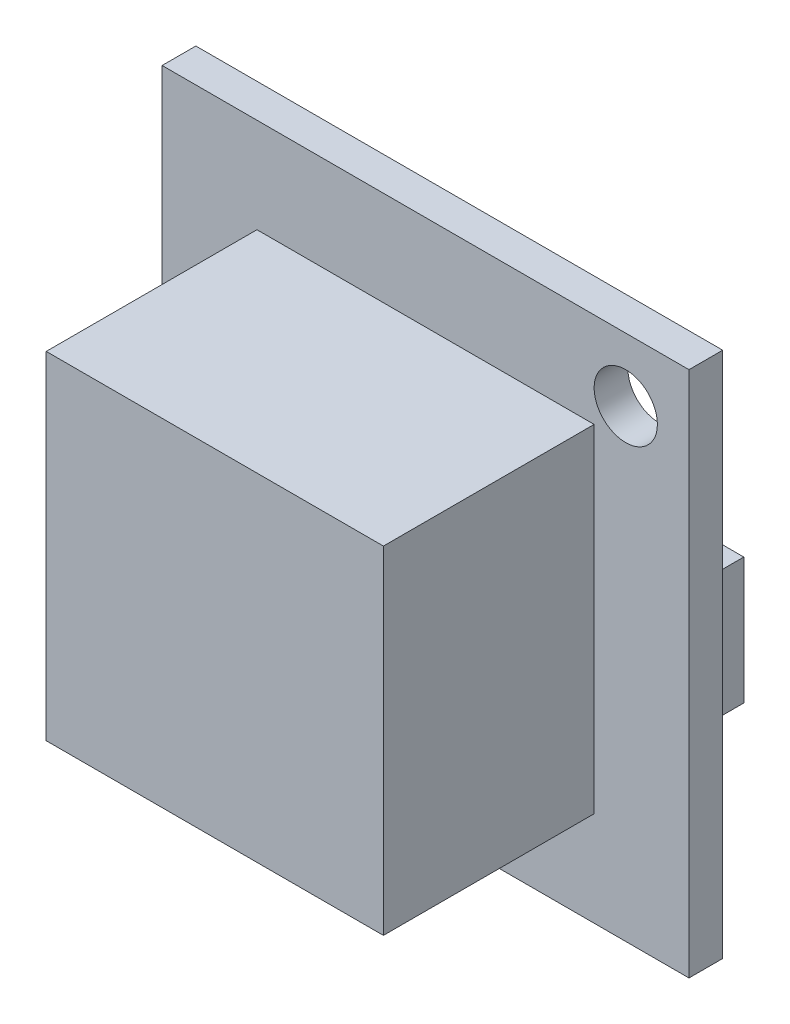
ISO-10303-21;
HEADER;
FILE_DESCRIPTION(('STEP AP214'),'2;1');
FILE_NAME('part.step','',(''),(''),'','','');
FILE_SCHEMA(('AUTOMOTIVE_DESIGN { 1 0 10303 214 1 1 1 1 }'));
ENDSEC;
DATA;
#1=APPLICATION_CONTEXT('core data for automotive mechanical design processes');
#2=APPLICATION_PROTOCOL_DEFINITION('international standard','automotive_design',2000,#1);
#3=PRODUCT_CONTEXT('',#1,'mechanical');
#4=PRODUCT('Part','Part','',(#3));
#5=PRODUCT_RELATED_PRODUCT_CATEGORY('part','',(#4));
#6=PRODUCT_DEFINITION_FORMATION('','',#4);
#7=PRODUCT_DEFINITION_CONTEXT('part definition',#1,'design');
#8=PRODUCT_DEFINITION('design','',#6,#7);
#9=PRODUCT_DEFINITION_SHAPE('','',#8);
#10=(LENGTH_UNIT() NAMED_UNIT(*) SI_UNIT(.MILLI.,.METRE.));
#11=(NAMED_UNIT(*) PLANE_ANGLE_UNIT() SI_UNIT($,.RADIAN.));
#12=(NAMED_UNIT(*) SI_UNIT($,.STERADIAN.) SOLID_ANGLE_UNIT());
#13=UNCERTAINTY_MEASURE_WITH_UNIT(LENGTH_MEASURE(1.E-05),#10,'distance_accuracy_value','');
#14=(GEOMETRIC_REPRESENTATION_CONTEXT(3) GLOBAL_UNCERTAINTY_ASSIGNED_CONTEXT((#13)) GLOBAL_UNIT_ASSIGNED_CONTEXT((#10,
#11,#12)) REPRESENTATION_CONTEXT('',''));
#15=CARTESIAN_POINT('',(0.,0.,0.));
#16=DIRECTION('',(0.,0.,1.));
#17=DIRECTION('',(1.,0.,0.));
#18=AXIS2_PLACEMENT_3D('',#15,#16,#17);
#19=CARTESIAN_POINT('',(3.5,-12.5,-8.));
#20=DIRECTION('',(-1.,0.,0.));
#21=DIRECTION('',(0.,0.,1.));
#22=AXIS2_PLACEMENT_3D('',#19,#20,#21);
#23=PLANE('',#22);
#24=DIRECTION('',(0.,-1.,0.));
#25=VECTOR('',#24,1.);
#26=CARTESIAN_POINT('',(3.5,-12.5,0.));
#27=LINE('',#26,#25);
#28=CARTESIAN_POINT('',(3.5,-7.5,0.));
#29=VERTEX_POINT('',#28);
#30=CARTESIAN_POINT('',(3.5,-12.5,0.));
#31=VERTEX_POINT('',#30);
#32=EDGE_CURVE('E108',#29,#31,#27,.T.);
#33=ORIENTED_EDGE('',*,*,#32,.T.);
#34=DIRECTION('',(0.,0.,1.));
#35=VECTOR('',#34,1.);
#36=CARTESIAN_POINT('',(3.5,-12.5,-8.));
#37=LINE('',#36,#35);
#38=CARTESIAN_POINT('',(3.5,-12.5,-8.));
#39=VERTEX_POINT('',#38);
#40=EDGE_CURVE('E12',#39,#31,#37,.T.);
#41=ORIENTED_EDGE('',*,*,#40,.F.);
#42=DIRECTION('',(0.,-1.,0.));
#43=VECTOR('',#42,1.);
#44=CARTESIAN_POINT('',(3.5,-12.5,-8.));
#45=LINE('',#44,#43);
#46=CARTESIAN_POINT('',(3.5,-7.5,-8.));
#47=VERTEX_POINT('',#46);
#48=EDGE_CURVE('E96',#47,#39,#45,.T.);
#49=ORIENTED_EDGE('',*,*,#48,.F.);
#50=DIRECTION('',(0.,0.,1.));
#51=VECTOR('',#50,1.);
#52=CARTESIAN_POINT('',(3.5,-7.5,-8.));
#53=LINE('',#52,#51);
#54=EDGE_CURVE('E104',#47,#29,#53,.T.);
#55=ORIENTED_EDGE('',*,*,#54,.T.);
#56=EDGE_LOOP('',(#33,#41,#49,#55));
#57=FACE_BOUND('',#56,.T.);
#58=ADVANCED_FACE('F45',(#57),#23,.F.);
#59=CARTESIAN_POINT('',(3.5,-12.5,-8.));
#60=DIRECTION('',(0.,1.,0.));
#61=DIRECTION('',(0.,0.,1.));
#62=AXIS2_PLACEMENT_3D('',#59,#60,#61);
#63=PLANE('',#62);
#64=DIRECTION('',(-1.,0.,0.));
#65=VECTOR('',#64,1.);
#66=CARTESIAN_POINT('',(3.5,-12.5,0.));
#67=LINE('',#66,#65);
#68=CARTESIAN_POINT('',(-3.5,-12.5,0.));
#69=VERTEX_POINT('',#68);
#70=EDGE_CURVE('E100',#31,#69,#67,.T.);
#71=ORIENTED_EDGE('',*,*,#70,.T.);
#72=DIRECTION('',(0.,0.,1.));
#73=VECTOR('',#72,1.);
#74=CARTESIAN_POINT('',(-3.5,-12.5,-8.));
#75=LINE('',#74,#73);
#76=CARTESIAN_POINT('',(-3.5,-12.5,-8.));
#77=VERTEX_POINT('',#76);
#78=EDGE_CURVE('E53',#77,#69,#75,.T.);
#79=ORIENTED_EDGE('',*,*,#78,.F.);
#80=DIRECTION('',(-1.,0.,0.));
#81=VECTOR('',#80,1.);
#82=CARTESIAN_POINT('',(3.5,-12.5,-8.));
#83=LINE('',#82,#81);
#84=EDGE_CURVE('E91',#39,#77,#83,.T.);
#85=ORIENTED_EDGE('',*,*,#84,.F.);
#86=ORIENTED_EDGE('',*,*,#40,.T.);
#87=EDGE_LOOP('',(#71,#79,#85,#86));
#88=FACE_BOUND('',#87,.T.);
#89=ADVANCED_FACE('F99',(#88),#63,.F.);
#90=CARTESIAN_POINT('',(-3.5,-12.5,-8.));
#91=DIRECTION('',(1.,0.,0.));
#92=DIRECTION('',(0.,1.,0.));
#93=AXIS2_PLACEMENT_3D('',#90,#91,#92);
#94=PLANE('',#93);
#95=DIRECTION('',(0.,1.,0.));
#96=VECTOR('',#95,1.);
#97=CARTESIAN_POINT('',(-3.5,-12.5,0.));
#98=LINE('',#97,#96);
#99=CARTESIAN_POINT('',(-3.5,-7.5,0.));
#100=VERTEX_POINT('',#99);
#101=EDGE_CURVE('E78',#69,#100,#98,.T.);
#102=ORIENTED_EDGE('',*,*,#101,.T.);
#103=DIRECTION('',(0.,0.,1.));
#104=VECTOR('',#103,1.);
#105=CARTESIAN_POINT('',(-3.5,-7.5,-8.));
#106=LINE('',#105,#104);
#107=CARTESIAN_POINT('',(-3.5,-7.5,-8.));
#108=VERTEX_POINT('',#107);
#109=EDGE_CURVE('E101',#108,#100,#106,.T.);
#110=ORIENTED_EDGE('',*,*,#109,.F.);
#111=DIRECTION('',(0.,1.,0.));
#112=VECTOR('',#111,1.);
#113=CARTESIAN_POINT('',(-3.5,-12.5,-8.));
#114=LINE('',#113,#112);
#115=EDGE_CURVE('E94',#77,#108,#114,.T.);
#116=ORIENTED_EDGE('',*,*,#115,.F.);
#117=ORIENTED_EDGE('',*,*,#78,.T.);
#118=EDGE_LOOP('',(#102,#110,#116,#117));
#119=FACE_BOUND('',#118,.T.);
#120=ADVANCED_FACE('F102',(#119),#94,.F.);
#121=CARTESIAN_POINT('',(3.5,-7.5,-8.));
#122=DIRECTION('',(0.,-1.,0.));
#123=DIRECTION('',(1.,0.,0.));
#124=AXIS2_PLACEMENT_3D('',#121,#122,#123);
#125=PLANE('',#124);
#126=DIRECTION('',(1.,0.,0.));
#127=VECTOR('',#126,1.);
#128=CARTESIAN_POINT('',(3.5,-7.5,0.));
#129=LINE('',#128,#127);
#130=EDGE_CURVE('E84',#100,#29,#129,.T.);
#131=ORIENTED_EDGE('',*,*,#130,.T.);
#132=ORIENTED_EDGE('',*,*,#54,.F.);
#133=DIRECTION('',(1.,0.,0.));
#134=VECTOR('',#133,1.);
#135=CARTESIAN_POINT('',(3.5,-7.5,-8.));
#136=LINE('',#135,#134);
#137=EDGE_CURVE('E61',#108,#47,#136,.T.);
#138=ORIENTED_EDGE('',*,*,#137,.F.);
#139=ORIENTED_EDGE('',*,*,#109,.T.);
#140=EDGE_LOOP('',(#131,#132,#138,#139));
#141=FACE_BOUND('',#140,.T.);
#142=ADVANCED_FACE('F115',(#141),#125,.F.);
#143=CARTESIAN_POINT('',(0.,0.,-8.));
#144=DIRECTION('',(0.,0.,1.));
#145=DIRECTION('',(1.,0.,0.));
#146=AXIS2_PLACEMENT_3D('',#143,#144,#145);
#147=PLANE('',#146);
#148=ORIENTED_EDGE('',*,*,#48,.T.);
#149=ORIENTED_EDGE('',*,*,#84,.T.);
#150=ORIENTED_EDGE('',*,*,#115,.T.);
#151=ORIENTED_EDGE('',*,*,#137,.T.);
#152=EDGE_LOOP('',(#148,#149,#150,#151));
#153=FACE_BOUND('',#152,.T.);
#154=ADVANCED_FACE('F92',(#153),#147,.F.);
#155=CARTESIAN_POINT('',(0.,0.,0.));
#156=DIRECTION('',(0.,0.,1.));
#157=DIRECTION('',(1.,0.,0.));
#158=AXIS2_PLACEMENT_3D('',#155,#156,#157);
#159=PLANE('',#158);
#160=ORIENTED_EDGE('',*,*,#32,.F.);
#161=ORIENTED_EDGE('',*,*,#130,.F.);
#162=ORIENTED_EDGE('',*,*,#101,.F.);
#163=ORIENTED_EDGE('',*,*,#70,.F.);
#164=EDGE_LOOP('',(#160,#161,#162,#163));
#165=FACE_BOUND('',#164,.T.);
#166=ADVANCED_FACE('F118',(#165),#159,.T.);
#167=CLOSED_SHELL('',(#58,#89,#120,#142,#154,#166));
#168=MANIFOLD_SOLID_BREP('B2',#167);
#169=CARTESIAN_POINT('',(0.,0.,0.));
#170=DIRECTION('',(0.,0.,-1.));
#171=DIRECTION('',(-1.,0.,0.));
#172=AXIS2_PLACEMENT_3D('',#169,#170,#171);
#173=PLANE('',#172);
#174=DIRECTION('',(0.,-1.,0.));
#175=VECTOR('',#174,1.);
#176=CARTESIAN_POINT('',(-12.5,12.5,0.));
#177=LINE('',#176,#175);
#178=CARTESIAN_POINT('',(-12.5,12.5,0.));
#179=VERTEX_POINT('',#178);
#180=CARTESIAN_POINT('',(-12.5,-12.5,0.));
#181=VERTEX_POINT('',#180);
#182=EDGE_CURVE('E337',#179,#181,#177,.T.);
#183=ORIENTED_EDGE('',*,*,#182,.F.);
#184=DIRECTION('',(-1.,0.,0.));
#185=VECTOR('',#184,1.);
#186=CARTESIAN_POINT('',(12.5,12.5,0.));
#187=LINE('',#186,#185);
#188=CARTESIAN_POINT('',(12.5,12.5,0.));
#189=VERTEX_POINT('',#188);
#190=EDGE_CURVE('E344',#189,#179,#187,.T.);
#191=ORIENTED_EDGE('',*,*,#190,.F.);
#192=DIRECTION('',(0.,1.,0.));
#193=VECTOR('',#192,1.);
#194=CARTESIAN_POINT('',(12.5,12.5,0.));
#195=LINE('',#194,#193);
#196=CARTESIAN_POINT('',(12.5,-12.5,0.));
#197=VERTEX_POINT('',#196);
#198=EDGE_CURVE('E355',#197,#189,#195,.T.);
#199=ORIENTED_EDGE('',*,*,#198,.F.);
#200=DIRECTION('',(1.,0.,0.));
#201=VECTOR('',#200,1.);
#202=CARTESIAN_POINT('',(12.5,-12.5,0.));
#203=LINE('',#202,#201);
#204=EDGE_CURVE('E353',#181,#197,#203,.T.);
#205=ORIENTED_EDGE('',*,*,#204,.F.);
#206=EDGE_LOOP('',(#183,#191,#199,#205));
#207=FACE_BOUND('',#206,.T.);
#208=CARTESIAN_POINT('',(9.50000000000001,9.5,0.));
#209=DIRECTION('',(0.,0.,1.));
#210=DIRECTION('',(1.,0.,0.));
#211=AXIS2_PLACEMENT_3D('',#208,#209,#210);
#212=CIRCLE('',#211,1.5);
#213=CARTESIAN_POINT('',(11.,9.5,0.));
#214=VERTEX_POINT('',#213);
#215=EDGE_CURVE('E334',#214,#214,#212,.T.);
#216=ORIENTED_EDGE('',*,*,#215,.T.);
#217=EDGE_LOOP('',(#216));
#218=FACE_BOUND('',#217,.T.);
#219=CARTESIAN_POINT('',(-9.5,-9.5,0.));
#220=DIRECTION('',(0.,0.,1.));
#221=DIRECTION('',(1.,0.,0.));
#222=AXIS2_PLACEMENT_3D('',#219,#220,#221);
#223=CIRCLE('',#222,1.5);
#224=CARTESIAN_POINT('',(-8.,-9.5,0.));
#225=VERTEX_POINT('',#224);
#226=EDGE_CURVE('E328',#225,#225,#223,.T.);
#227=ORIENTED_EDGE('',*,*,#226,.T.);
#228=EDGE_LOOP('',(#227));
#229=FACE_BOUND('',#228,.T.);
#230=DIRECTION('',(-1.,0.,0.));
#231=VECTOR('',#230,1.);
#232=CARTESIAN_POINT('',(11.5,-3.5,0.));
#233=LINE('',#232,#231);
#234=CARTESIAN_POINT('',(11.5,-3.5,0.));
#235=VERTEX_POINT('',#234);
#236=CARTESIAN_POINT('',(5.5,-3.5,0.));
#237=VERTEX_POINT('',#236);
#238=EDGE_CURVE('E573',#235,#237,#233,.T.);
#239=ORIENTED_EDGE('',*,*,#238,.F.);
#240=DIRECTION('',(0.,-1.,0.));
#241=VECTOR('',#240,1.);
#242=CARTESIAN_POINT('',(11.5,2.5,0.));
#243=LINE('',#242,#241);
#244=CARTESIAN_POINT('',(11.5,2.5,0.));
#245=VERTEX_POINT('',#244);
#246=EDGE_CURVE('E291',#245,#235,#243,.T.);
#247=ORIENTED_EDGE('',*,*,#246,.F.);
#248=DIRECTION('',(1.,0.,0.));
#249=VECTOR('',#248,1.);
#250=CARTESIAN_POINT('',(11.5,2.5,0.));
#251=LINE('',#250,#249);
#252=CARTESIAN_POINT('',(5.5,2.5,0.));
#253=VERTEX_POINT('',#252);
#254=EDGE_CURVE('E287',#253,#245,#251,.T.);
#255=ORIENTED_EDGE('',*,*,#254,.F.);
#256=DIRECTION('',(0.,1.,0.));
#257=VECTOR('',#256,1.);
#258=CARTESIAN_POINT('',(5.5,2.5,0.));
#259=LINE('',#258,#257);
#260=EDGE_CURVE('E570',#237,#253,#259,.T.);
#261=ORIENTED_EDGE('',*,*,#260,.F.);
#262=EDGE_LOOP('',(#239,#247,#255,#261));
#263=FACE_BOUND('',#262,.T.);
#264=ADVANCED_FACE('F179',(#207,#218,#229,#263),#173,.T.);
#265=CARTESIAN_POINT('',(0.,0.,1.6));
#266=DIRECTION('',(0.,0.,-1.));
#267=DIRECTION('',(-1.,0.,0.));
#268=AXIS2_PLACEMENT_3D('',#265,#266,#267);
#269=PLANE('',#268);
#270=DIRECTION('',(0.,-1.,0.));
#271=VECTOR('',#270,1.);
#272=CARTESIAN_POINT('',(-12.5,12.5,1.6));
#273=LINE('',#272,#271);
#274=CARTESIAN_POINT('',(-12.5,12.5,1.6));
#275=VERTEX_POINT('',#274);
#276=CARTESIAN_POINT('',(-12.5,-12.5,1.6));
#277=VERTEX_POINT('',#276);
#278=EDGE_CURVE('E340',#275,#277,#273,.T.);
#279=ORIENTED_EDGE('',*,*,#278,.T.);
#280=DIRECTION('',(1.,0.,0.));
#281=VECTOR('',#280,1.);
#282=CARTESIAN_POINT('',(12.5,-12.5,1.6));
#283=LINE('',#282,#281);
#284=CARTESIAN_POINT('',(12.5,-12.5,1.6));
#285=VERTEX_POINT('',#284);
#286=EDGE_CURVE('E343',#277,#285,#283,.T.);
#287=ORIENTED_EDGE('',*,*,#286,.T.);
#288=DIRECTION('',(0.,1.,0.));
#289=VECTOR('',#288,1.);
#290=CARTESIAN_POINT('',(12.5,12.5,1.6));
#291=LINE('',#290,#289);
#292=CARTESIAN_POINT('',(12.5,12.5,1.6));
#293=VERTEX_POINT('',#292);
#294=EDGE_CURVE('E346',#285,#293,#291,.T.);
#295=ORIENTED_EDGE('',*,*,#294,.T.);
#296=DIRECTION('',(-1.,0.,0.));
#297=VECTOR('',#296,1.);
#298=CARTESIAN_POINT('',(12.5,12.5,1.6));
#299=LINE('',#298,#297);
#300=EDGE_CURVE('E348',#293,#275,#299,.T.);
#301=ORIENTED_EDGE('',*,*,#300,.T.);
#302=EDGE_LOOP('',(#279,#287,#295,#301));
#303=FACE_BOUND('',#302,.T.);
#304=CARTESIAN_POINT('',(9.50000000000001,9.5,1.6));
#305=DIRECTION('',(0.,0.,1.));
#306=DIRECTION('',(1.,0.,0.));
#307=AXIS2_PLACEMENT_3D('',#304,#305,#306);
#308=CIRCLE('',#307,1.5);
#309=CARTESIAN_POINT('',(11.,9.5,1.6));
#310=VERTEX_POINT('',#309);
#311=EDGE_CURVE('E331',#310,#310,#308,.T.);
#312=ORIENTED_EDGE('',*,*,#311,.F.);
#313=EDGE_LOOP('',(#312));
#314=FACE_BOUND('',#313,.T.);
#315=CARTESIAN_POINT('',(-9.5,-9.5,1.6));
#316=DIRECTION('',(0.,0.,1.));
#317=DIRECTION('',(1.,0.,0.));
#318=AXIS2_PLACEMENT_3D('',#315,#316,#317);
#319=CIRCLE('',#318,1.5);
#320=CARTESIAN_POINT('',(-8.,-9.5,1.6));
#321=VERTEX_POINT('',#320);
#322=EDGE_CURVE('E327',#321,#321,#319,.T.);
#323=ORIENTED_EDGE('',*,*,#322,.F.);
#324=EDGE_LOOP('',(#323));
#325=FACE_BOUND('',#324,.T.);
#326=DIRECTION('',(0.,-1.,0.));
#327=VECTOR('',#326,1.);
#328=CARTESIAN_POINT('',(-8.,-8.,1.6));
#329=LINE('',#328,#327);
#330=CARTESIAN_POINT('',(-8.,8.,1.6));
#331=VERTEX_POINT('',#330);
#332=CARTESIAN_POINT('',(-8.,-8.,1.6));
#333=VERTEX_POINT('',#332);
#334=EDGE_CURVE('E293',#331,#333,#329,.T.);
#335=ORIENTED_EDGE('',*,*,#334,.F.);
#336=DIRECTION('',(-1.,0.,0.));
#337=VECTOR('',#336,1.);
#338=CARTESIAN_POINT('',(8.,8.,1.6));
#339=LINE('',#338,#337);
#340=CARTESIAN_POINT('',(8.,8.,1.6));
#341=VERTEX_POINT('',#340);
#342=EDGE_CURVE('E304',#341,#331,#339,.T.);
#343=ORIENTED_EDGE('',*,*,#342,.F.);
#344=DIRECTION('',(0.,1.,0.));
#345=VECTOR('',#344,1.);
#346=CARTESIAN_POINT('',(8.,-8.,1.6));
#347=LINE('',#346,#345);
#348=CARTESIAN_POINT('',(8.,-8.,1.6));
#349=VERTEX_POINT('',#348);
#350=EDGE_CURVE('E312',#349,#341,#347,.T.);
#351=ORIENTED_EDGE('',*,*,#350,.F.);
#352=DIRECTION('',(1.,0.,0.));
#353=VECTOR('',#352,1.);
#354=CARTESIAN_POINT('',(8.,-8.,1.6));
#355=LINE('',#354,#353);
#356=EDGE_CURVE('E202',#333,#349,#355,.T.);
#357=ORIENTED_EDGE('',*,*,#356,.F.);
#358=EDGE_LOOP('',(#335,#343,#351,#357));
#359=FACE_BOUND('',#358,.T.);
#360=ADVANCED_FACE('F382',(#303,#314,#325,#359),#269,.F.);
#361=CARTESIAN_POINT('',(-12.5,12.5,1.6));
#362=DIRECTION('',(1.,0.,0.));
#363=DIRECTION('',(0.,1.,0.));
#364=AXIS2_PLACEMENT_3D('',#361,#362,#363);
#365=PLANE('',#364);
#366=ORIENTED_EDGE('',*,*,#182,.T.);
#367=DIRECTION('',(0.,0.,-1.));
#368=VECTOR('',#367,1.);
#369=CARTESIAN_POINT('',(-12.5,-12.5,1.6));
#370=LINE('',#369,#368);
#371=EDGE_CURVE('E43',#277,#181,#370,.T.);
#372=ORIENTED_EDGE('',*,*,#371,.F.);
#373=ORIENTED_EDGE('',*,*,#278,.F.);
#374=DIRECTION('',(0.,0.,-1.));
#375=VECTOR('',#374,1.);
#376=CARTESIAN_POINT('',(-12.5,12.5,1.6));
#377=LINE('',#376,#375);
#378=EDGE_CURVE('E350',#275,#179,#377,.T.);
#379=ORIENTED_EDGE('',*,*,#378,.T.);
#380=EDGE_LOOP('',(#366,#372,#373,#379));
#381=FACE_BOUND('',#380,.T.);
#382=ADVANCED_FACE('F181',(#381),#365,.F.);
#383=CARTESIAN_POINT('',(12.5,-12.5,1.6));
#384=DIRECTION('',(0.,1.,0.));
#385=DIRECTION('',(-1.,0.,0.));
#386=AXIS2_PLACEMENT_3D('',#383,#384,#385);
#387=PLANE('',#386);
#388=ORIENTED_EDGE('',*,*,#204,.T.);
#389=DIRECTION('',(0.,0.,-1.));
#390=VECTOR('',#389,1.);
#391=CARTESIAN_POINT('',(12.5,-12.5,1.6));
#392=LINE('',#391,#390);
#393=EDGE_CURVE('E187',#285,#197,#392,.T.);
#394=ORIENTED_EDGE('',*,*,#393,.F.);
#395=ORIENTED_EDGE('',*,*,#286,.F.);
#396=ORIENTED_EDGE('',*,*,#371,.T.);
#397=EDGE_LOOP('',(#388,#394,#395,#396));
#398=FACE_BOUND('',#397,.T.);
#399=ADVANCED_FACE('F384',(#398),#387,.F.);
#400=CARTESIAN_POINT('',(12.5,12.5,1.6));
#401=DIRECTION('',(-1.,0.,0.));
#402=DIRECTION('',(0.,-1.,0.));
#403=AXIS2_PLACEMENT_3D('',#400,#401,#402);
#404=PLANE('',#403);
#405=ORIENTED_EDGE('',*,*,#198,.T.);
#406=DIRECTION('',(0.,0.,-1.));
#407=VECTOR('',#406,1.);
#408=CARTESIAN_POINT('',(12.5,12.5,1.6));
#409=LINE('',#408,#407);
#410=EDGE_CURVE('E360',#293,#189,#409,.T.);
#411=ORIENTED_EDGE('',*,*,#410,.F.);
#412=ORIENTED_EDGE('',*,*,#294,.F.);
#413=ORIENTED_EDGE('',*,*,#393,.T.);
#414=EDGE_LOOP('',(#405,#411,#412,#413));
#415=FACE_BOUND('',#414,.T.);
#416=ADVANCED_FACE('F367',(#415),#404,.F.);
#417=CARTESIAN_POINT('',(12.5,12.5,1.6));
#418=DIRECTION('',(0.,-1.,0.));
#419=DIRECTION('',(1.,0.,0.));
#420=AXIS2_PLACEMENT_3D('',#417,#418,#419);
#421=PLANE('',#420);
#422=ORIENTED_EDGE('',*,*,#190,.T.);
#423=ORIENTED_EDGE('',*,*,#378,.F.);
#424=ORIENTED_EDGE('',*,*,#300,.F.);
#425=ORIENTED_EDGE('',*,*,#410,.T.);
#426=EDGE_LOOP('',(#422,#423,#424,#425));
#427=FACE_BOUND('',#426,.T.);
#428=ADVANCED_FACE('F376',(#427),#421,.F.);
#429=CARTESIAN_POINT('',(9.50000000000001,9.5,0.));
#430=DIRECTION('',(0.,0.,1.));
#431=DIRECTION('',(1.,0.,0.));
#432=AXIS2_PLACEMENT_3D('',#429,#430,#431);
#433=CYLINDRICAL_SURFACE('',#432,1.5);
#434=ORIENTED_EDGE('',*,*,#215,.F.);
#435=EDGE_LOOP('',(#434));
#436=FACE_BOUND('',#435,.T.);
#437=ORIENTED_EDGE('',*,*,#311,.T.);
#438=EDGE_LOOP('',(#437));
#439=FACE_BOUND('',#438,.T.);
#440=ADVANCED_FACE('F400',(#436,#439),#433,.F.);
#441=CARTESIAN_POINT('',(-9.5,-9.5,0.));
#442=DIRECTION('',(0.,0.,1.));
#443=DIRECTION('',(1.,0.,0.));
#444=AXIS2_PLACEMENT_3D('',#441,#442,#443);
#445=CYLINDRICAL_SURFACE('',#444,1.5);
#446=ORIENTED_EDGE('',*,*,#226,.F.);
#447=EDGE_LOOP('',(#446));
#448=FACE_BOUND('',#447,.T.);
#449=ORIENTED_EDGE('',*,*,#322,.T.);
#450=EDGE_LOOP('',(#449));
#451=FACE_BOUND('',#450,.T.);
#452=ADVANCED_FACE('F404',(#448,#451),#445,.F.);
#453=CARTESIAN_POINT('',(-8.,-8.,11.6));
#454=DIRECTION('',(1.,0.,0.));
#455=DIRECTION('',(0.,0.,-1.));
#456=AXIS2_PLACEMENT_3D('',#453,#454,#455);
#457=PLANE('',#456);
#458=ORIENTED_EDGE('',*,*,#334,.T.);
#459=DIRECTION('',(0.,0.,-1.));
#460=VECTOR('',#459,1.);
#461=CARTESIAN_POINT('',(-8.,-8.,11.6));
#462=LINE('',#461,#460);
#463=CARTESIAN_POINT('',(-8.,-8.,11.6));
#464=VERTEX_POINT('',#463);
#465=EDGE_CURVE('E325',#464,#333,#462,.T.);
#466=ORIENTED_EDGE('',*,*,#465,.F.);
#467=DIRECTION('',(0.,-1.,0.));
#468=VECTOR('',#467,1.);
#469=CARTESIAN_POINT('',(-8.,-8.,11.6));
#470=LINE('',#469,#468);
#471=CARTESIAN_POINT('',(-8.,8.,11.6));
#472=VERTEX_POINT('',#471);
#473=EDGE_CURVE('E300',#472,#464,#470,.T.);
#474=ORIENTED_EDGE('',*,*,#473,.F.);
#475=DIRECTION('',(0.,0.,-1.));
#476=VECTOR('',#475,1.);
#477=CARTESIAN_POINT('',(-8.,8.,11.6));
#478=LINE('',#477,#476);
#479=EDGE_CURVE('E309',#472,#331,#478,.T.);
#480=ORIENTED_EDGE('',*,*,#479,.T.);
#481=EDGE_LOOP('',(#458,#466,#474,#480));
#482=FACE_BOUND('',#481,.T.);
#483=ADVANCED_FACE('F409',(#482),#457,.F.);
#484=CARTESIAN_POINT('',(8.,-8.,11.6));
#485=DIRECTION('',(0.,1.,0.));
#486=DIRECTION('',(-1.,0.,0.));
#487=AXIS2_PLACEMENT_3D('',#484,#485,#486);
#488=PLANE('',#487);
#489=ORIENTED_EDGE('',*,*,#356,.T.);
#490=DIRECTION('',(0.,0.,-1.));
#491=VECTOR('',#490,1.);
#492=CARTESIAN_POINT('',(8.,-8.,11.6));
#493=LINE('',#492,#491);
#494=CARTESIAN_POINT('',(8.,-8.,11.6));
#495=VERTEX_POINT('',#494);
#496=EDGE_CURVE('E322',#495,#349,#493,.T.);
#497=ORIENTED_EDGE('',*,*,#496,.F.);
#498=DIRECTION('',(1.,0.,0.));
#499=VECTOR('',#498,1.);
#500=CARTESIAN_POINT('',(8.,-8.,11.6));
#501=LINE('',#500,#499);
#502=EDGE_CURVE('E303',#464,#495,#501,.T.);
#503=ORIENTED_EDGE('',*,*,#502,.F.);
#504=ORIENTED_EDGE('',*,*,#465,.T.);
#505=EDGE_LOOP('',(#489,#497,#503,#504));
#506=FACE_BOUND('',#505,.T.);
#507=ADVANCED_FACE('F417',(#506),#488,.F.);
#508=CARTESIAN_POINT('',(8.,-8.,11.6));
#509=DIRECTION('',(-1.,0.,0.));
#510=DIRECTION('',(0.,0.,1.));
#511=AXIS2_PLACEMENT_3D('',#508,#509,#510);
#512=PLANE('',#511);
#513=ORIENTED_EDGE('',*,*,#350,.T.);
#514=DIRECTION('',(0.,0.,-1.));
#515=VECTOR('',#514,1.);
#516=CARTESIAN_POINT('',(8.,8.,11.6));
#517=LINE('',#516,#515);
#518=CARTESIAN_POINT('',(8.,8.,11.6));
#519=VERTEX_POINT('',#518);
#520=EDGE_CURVE('E319',#519,#341,#517,.T.);
#521=ORIENTED_EDGE('',*,*,#520,.F.);
#522=DIRECTION('',(0.,1.,0.));
#523=VECTOR('',#522,1.);
#524=CARTESIAN_POINT('',(8.,-8.,11.6));
#525=LINE('',#524,#523);
#526=EDGE_CURVE('E306',#495,#519,#525,.T.);
#527=ORIENTED_EDGE('',*,*,#526,.F.);
#528=ORIENTED_EDGE('',*,*,#496,.T.);
#529=EDGE_LOOP('',(#513,#521,#527,#528));
#530=FACE_BOUND('',#529,.T.);
#531=ADVANCED_FACE('F421',(#530),#512,.F.);
#532=CARTESIAN_POINT('',(8.,8.,11.6));
#533=DIRECTION('',(0.,-1.,0.));
#534=DIRECTION('',(1.,0.,0.));
#535=AXIS2_PLACEMENT_3D('',#532,#533,#534);
#536=PLANE('',#535);
#537=ORIENTED_EDGE('',*,*,#342,.T.);
#538=ORIENTED_EDGE('',*,*,#479,.F.);
#539=DIRECTION('',(-1.,0.,0.));
#540=VECTOR('',#539,1.);
#541=CARTESIAN_POINT('',(8.,8.,11.6));
#542=LINE('',#541,#540);
#543=EDGE_CURVE('E308',#519,#472,#542,.T.);
#544=ORIENTED_EDGE('',*,*,#543,.F.);
#545=ORIENTED_EDGE('',*,*,#520,.T.);
#546=EDGE_LOOP('',(#537,#538,#544,#545));
#547=FACE_BOUND('',#546,.T.);
#548=ADVANCED_FACE('F425',(#547),#536,.F.);
#549=CARTESIAN_POINT('',(0.,0.,11.6));
#550=DIRECTION('',(0.,0.,1.));
#551=DIRECTION('',(1.,0.,0.));
#552=AXIS2_PLACEMENT_3D('',#549,#550,#551);
#553=PLANE('',#552);
#554=ORIENTED_EDGE('',*,*,#473,.T.);
#555=ORIENTED_EDGE('',*,*,#502,.T.);
#556=ORIENTED_EDGE('',*,*,#526,.T.);
#557=ORIENTED_EDGE('',*,*,#543,.T.);
#558=EDGE_LOOP('',(#554,#555,#556,#557));
#559=FACE_BOUND('',#558,.T.);
#560=ADVANCED_FACE('F429',(#559),#553,.T.);
#561=CARTESIAN_POINT('',(11.5,2.5,-2.));
#562=DIRECTION('',(-1.,0.,0.));
#563=DIRECTION('',(0.,-1.,0.));
#564=AXIS2_PLACEMENT_3D('',#561,#562,#563);
#565=PLANE('',#564);
#566=ORIENTED_EDGE('',*,*,#246,.T.);
#567=DIRECTION('',(0.,0.,1.));
#568=VECTOR('',#567,1.);
#569=CARTESIAN_POINT('',(11.5,-3.5,-2.));
#570=LINE('',#569,#568);
#571=CARTESIAN_POINT('',(11.5,-3.5,-2.));
#572=VERTEX_POINT('',#571);
#573=EDGE_CURVE('E272',#572,#235,#570,.T.);
#574=ORIENTED_EDGE('',*,*,#573,.F.);
#575=DIRECTION('',(0.,-1.,0.));
#576=VECTOR('',#575,1.);
#577=CARTESIAN_POINT('',(11.5,2.5,-2.));
#578=LINE('',#577,#576);
#579=CARTESIAN_POINT('',(11.5,2.5,-2.));
#580=VERTEX_POINT('',#579);
#581=EDGE_CURVE('E279',#580,#572,#578,.T.);
#582=ORIENTED_EDGE('',*,*,#581,.F.);
#583=DIRECTION('',(0.,0.,1.));
#584=VECTOR('',#583,1.);
#585=CARTESIAN_POINT('',(11.5,2.5,-2.));
#586=LINE('',#585,#584);
#587=EDGE_CURVE('E567',#580,#245,#586,.T.);
#588=ORIENTED_EDGE('',*,*,#587,.T.);
#589=EDGE_LOOP('',(#566,#574,#582,#588));
#590=FACE_BOUND('',#589,.T.);
#591=ADVANCED_FACE('F289',(#590),#565,.F.);
#592=CARTESIAN_POINT('',(11.5,-3.5,-2.));
#593=DIRECTION('',(0.,1.,0.));
#594=DIRECTION('',(0.,0.,1.));
#595=AXIS2_PLACEMENT_3D('',#592,#593,#594);
#596=PLANE('',#595);
#597=ORIENTED_EDGE('',*,*,#238,.T.);
#598=DIRECTION('',(0.,0.,1.));
#599=VECTOR('',#598,1.);
#600=CARTESIAN_POINT('',(5.5,-3.5,-2.));
#601=LINE('',#600,#599);
#602=CARTESIAN_POINT('',(5.5,-3.5,-2.));
#603=VERTEX_POINT('',#602);
#604=EDGE_CURVE('E275',#603,#237,#601,.T.);
#605=ORIENTED_EDGE('',*,*,#604,.F.);
#606=DIRECTION('',(-1.,0.,0.));
#607=VECTOR('',#606,1.);
#608=CARTESIAN_POINT('',(11.5,-3.5,-2.));
#609=LINE('',#608,#607);
#610=EDGE_CURVE('E268',#572,#603,#609,.T.);
#611=ORIENTED_EDGE('',*,*,#610,.F.);
#612=ORIENTED_EDGE('',*,*,#573,.T.);
#613=EDGE_LOOP('',(#597,#605,#611,#612));
#614=FACE_BOUND('',#613,.T.);
#615=ADVANCED_FACE('F270',(#614),#596,.F.);
#616=CARTESIAN_POINT('',(5.5,2.5,-2.));
#617=DIRECTION('',(1.,0.,0.));
#618=DIRECTION('',(0.,1.,0.));
#619=AXIS2_PLACEMENT_3D('',#616,#617,#618);
#620=PLANE('',#619);
#621=ORIENTED_EDGE('',*,*,#260,.T.);
#622=DIRECTION('',(0.,0.,1.));
#623=VECTOR('',#622,1.);
#624=CARTESIAN_POINT('',(5.5,2.5,-2.));
#625=LINE('',#624,#623);
#626=CARTESIAN_POINT('',(5.5,2.5,-2.));
#627=VERTEX_POINT('',#626);
#628=EDGE_CURVE('E194',#627,#253,#625,.T.);
#629=ORIENTED_EDGE('',*,*,#628,.F.);
#630=DIRECTION('',(0.,1.,0.));
#631=VECTOR('',#630,1.);
#632=CARTESIAN_POINT('',(5.5,2.5,-2.));
#633=LINE('',#632,#631);
#634=EDGE_CURVE('E278',#603,#627,#633,.T.);
#635=ORIENTED_EDGE('',*,*,#634,.F.);
#636=ORIENTED_EDGE('',*,*,#604,.T.);
#637=EDGE_LOOP('',(#621,#629,#635,#636));
#638=FACE_BOUND('',#637,.T.);
#639=ADVANCED_FACE('F438',(#638),#620,.F.);
#640=CARTESIAN_POINT('',(11.5,2.5,-2.));
#641=DIRECTION('',(0.,-1.,0.));
#642=DIRECTION('',(0.,0.,-1.));
#643=AXIS2_PLACEMENT_3D('',#640,#641,#642);
#644=PLANE('',#643);
#645=ORIENTED_EDGE('',*,*,#254,.T.);
#646=ORIENTED_EDGE('',*,*,#587,.F.);
#647=DIRECTION('',(1.,0.,0.));
#648=VECTOR('',#647,1.);
#649=CARTESIAN_POINT('',(11.5,2.5,-2.));
#650=LINE('',#649,#648);
#651=EDGE_CURVE('E283',#627,#580,#650,.T.);
#652=ORIENTED_EDGE('',*,*,#651,.F.);
#653=ORIENTED_EDGE('',*,*,#628,.T.);
#654=EDGE_LOOP('',(#645,#646,#652,#653));
#655=FACE_BOUND('',#654,.T.);
#656=ADVANCED_FACE('F441',(#655),#644,.F.);
#657=CARTESIAN_POINT('',(0.,0.,-2.));
#658=DIRECTION('',(0.,0.,-1.));
#659=DIRECTION('',(-1.,0.,0.));
#660=AXIS2_PLACEMENT_3D('',#657,#658,#659);
#661=PLANE('',#660);
#662=ORIENTED_EDGE('',*,*,#581,.T.);
#663=ORIENTED_EDGE('',*,*,#610,.T.);
#664=ORIENTED_EDGE('',*,*,#634,.T.);
#665=ORIENTED_EDGE('',*,*,#651,.T.);
#666=EDGE_LOOP('',(#662,#663,#664,#665));
#667=FACE_BOUND('',#666,.T.);
#668=ADVANCED_FACE('F282',(#667),#661,.T.);
#669=CLOSED_SHELL('',(#264,#360,#382,#399,#416,#428,#440,#452,#483,#507,#531,#548,#560,#591,
#615,#639,#656,#668));
#670=MANIFOLD_SOLID_BREP('B6',#669);
#671=ADVANCED_BREP_SHAPE_REPRESENTATION('',(#18,#168,#670),#14);
#672=SHAPE_DEFINITION_REPRESENTATION(#9,#671);
ENDSEC;
END-ISO-10303-21;
